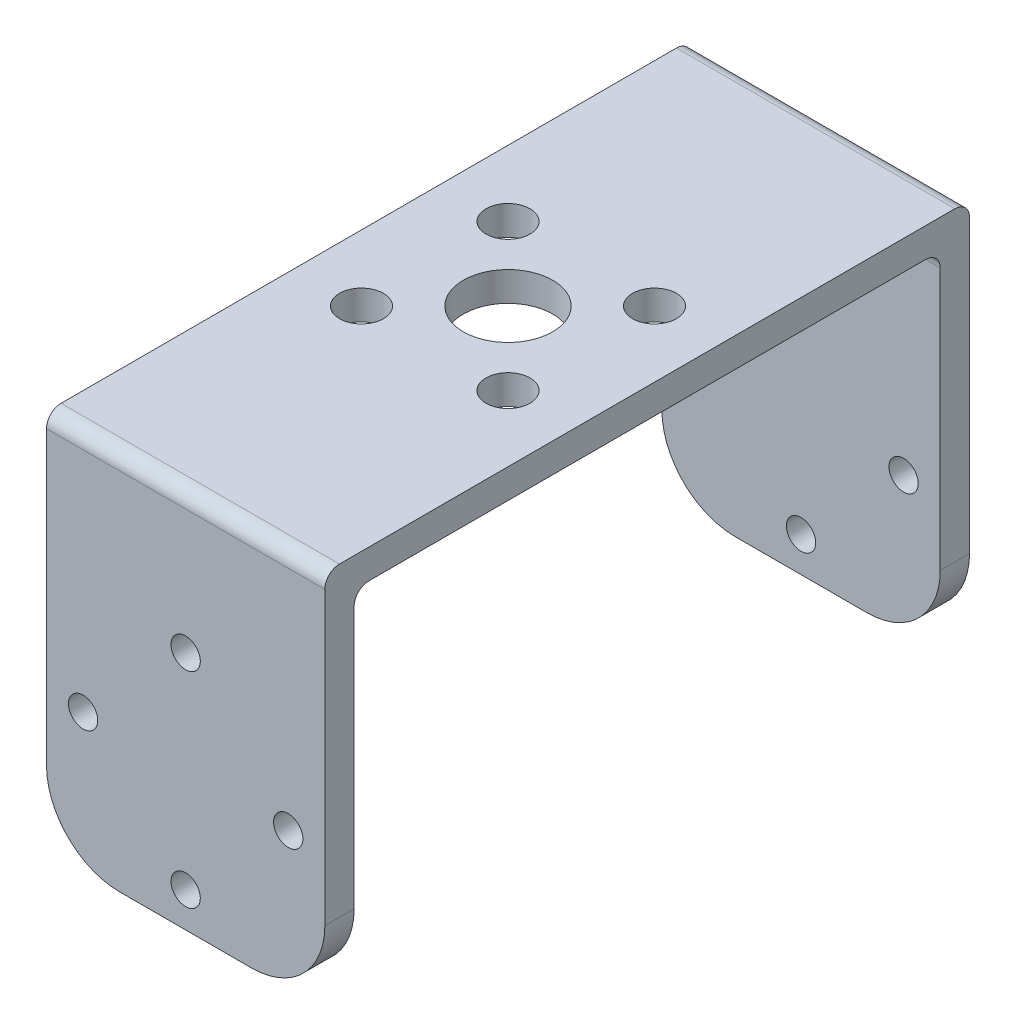
ISO-10303-21;
HEADER;
FILE_DESCRIPTION(('STEP AP214'),'2;1');
FILE_NAME('part.step','',(''),(''),'','','');
FILE_SCHEMA(('AUTOMOTIVE_DESIGN { 1 0 10303 214 1 1 1 1 }'));
ENDSEC;
DATA;
#1=APPLICATION_CONTEXT('core data for automotive mechanical design processes');
#2=APPLICATION_PROTOCOL_DEFINITION('international standard','automotive_design',2000,#1);
#3=PRODUCT_CONTEXT('',#1,'mechanical');
#4=PRODUCT('Part','Part','',(#3));
#5=PRODUCT_RELATED_PRODUCT_CATEGORY('part','',(#4));
#6=PRODUCT_DEFINITION_FORMATION('','',#4);
#7=PRODUCT_DEFINITION_CONTEXT('part definition',#1,'design');
#8=PRODUCT_DEFINITION('design','',#6,#7);
#9=PRODUCT_DEFINITION_SHAPE('','',#8);
#10=(LENGTH_UNIT() NAMED_UNIT(*) SI_UNIT(.MILLI.,.METRE.));
#11=(NAMED_UNIT(*) PLANE_ANGLE_UNIT() SI_UNIT($,.RADIAN.));
#12=(NAMED_UNIT(*) SI_UNIT($,.STERADIAN.) SOLID_ANGLE_UNIT());
#13=UNCERTAINTY_MEASURE_WITH_UNIT(LENGTH_MEASURE(1.E-05),#10,'distance_accuracy_value','');
#14=(GEOMETRIC_REPRESENTATION_CONTEXT(3) GLOBAL_UNCERTAINTY_ASSIGNED_CONTEXT((#13)) GLOBAL_UNIT_ASSIGNED_CONTEXT((#10,
#11,#12)) REPRESENTATION_CONTEXT('',''));
#15=CARTESIAN_POINT('',(0.,0.,0.));
#16=DIRECTION('',(0.,0.,1.));
#17=DIRECTION('',(1.,0.,0.));
#18=AXIS2_PLACEMENT_3D('',#15,#16,#17);
#19=CARTESIAN_POINT('',(19.,-12.94,-20.));
#20=DIRECTION('',(0.,1.,0.));
#21=DIRECTION('',(0.,0.,1.));
#22=AXIS2_PLACEMENT_3D('',#19,#20,#21);
#23=PLANE('',#22);
#24=DIRECTION('',(-1.,0.,0.));
#25=VECTOR('',#24,1.);
#26=CARTESIAN_POINT('',(19.,-12.94,-20.));
#27=LINE('',#26,#25);
#28=CARTESIAN_POINT('',(14.,-12.94,-20.));
#29=VERTEX_POINT('',#28);
#30=CARTESIAN_POINT('',(5.,-12.94,-20.));
#31=VERTEX_POINT('',#30);
#32=EDGE_CURVE('E188',#29,#31,#27,.T.);
#33=ORIENTED_EDGE('',*,*,#32,.T.);
#34=DIRECTION('',(0.,0.,-1.));
#35=VECTOR('',#34,1.);
#36=CARTESIAN_POINT('',(5.,-12.94,-22.));
#37=LINE('',#36,#35);
#38=CARTESIAN_POINT('',(5.,-12.94,-22.));
#39=VERTEX_POINT('',#38);
#40=EDGE_CURVE('E269',#31,#39,#37,.T.);
#41=ORIENTED_EDGE('',*,*,#40,.T.);
#42=DIRECTION('',(-1.,0.,0.));
#43=VECTOR('',#42,1.);
#44=CARTESIAN_POINT('',(19.,-12.94,-22.));
#45=LINE('',#44,#43);
#46=CARTESIAN_POINT('',(14.,-12.94,-22.));
#47=VERTEX_POINT('',#46);
#48=EDGE_CURVE('E198',#47,#39,#45,.T.);
#49=ORIENTED_EDGE('',*,*,#48,.F.);
#50=DIRECTION('',(0.,0.,-1.));
#51=VECTOR('',#50,1.);
#52=CARTESIAN_POINT('',(14.,-12.94,-20.));
#53=LINE('',#52,#51);
#54=EDGE_CURVE('E267',#47,#29,#53,.F.);
#55=ORIENTED_EDGE('',*,*,#54,.T.);
#56=EDGE_LOOP('',(#33,#41,#49,#55));
#57=FACE_BOUND('',#56,.T.);
#58=ADVANCED_FACE('F35',(#57),#23,.F.);
#59=CARTESIAN_POINT('',(19.,12.94,-22.));
#60=DIRECTION('',(0.,0.,1.));
#61=DIRECTION('',(1.,0.,0.));
#62=AXIS2_PLACEMENT_3D('',#59,#60,#61);
#63=PLANE('',#62);
#64=CARTESIAN_POINT('',(2.5,-3.56,-21.9999999999914));
#65=DIRECTION('',(0.,0.,1.));
#66=DIRECTION('',(1.,0.,0.));
#67=AXIS2_PLACEMENT_3D('',#64,#65,#66);
#68=CIRCLE('',#67,1.);
#69=CARTESIAN_POINT('',(3.5,-3.56,-21.9999999999914));
#70=VERTEX_POINT('',#69);
#71=EDGE_CURVE('E320',#70,#70,#68,.T.);
#72=ORIENTED_EDGE('',*,*,#71,.T.);
#73=EDGE_LOOP('',(#72));
#74=FACE_BOUND('',#73,.T.);
#75=CARTESIAN_POINT('',(16.5,-3.56,-21.9999999999914));
#76=DIRECTION('',(0.,0.,1.));
#77=DIRECTION('',(1.,0.,0.));
#78=AXIS2_PLACEMENT_3D('',#75,#76,#77);
#79=CIRCLE('',#78,1.);
#80=CARTESIAN_POINT('',(17.5,-3.56,-21.9999999999914));
#81=VERTEX_POINT('',#80);
#82=EDGE_CURVE('E249',#81,#81,#79,.T.);
#83=ORIENTED_EDGE('',*,*,#82,.T.);
#84=EDGE_LOOP('',(#83));
#85=FACE_BOUND('',#84,.T.);
#86=CARTESIAN_POINT('',(9.5,-10.56,-21.9999999999914));
#87=DIRECTION('',(0.,0.,1.));
#88=DIRECTION('',(1.,0.,0.));
#89=AXIS2_PLACEMENT_3D('',#86,#87,#88);
#90=CIRCLE('',#89,0.999999999999999);
#91=CARTESIAN_POINT('',(10.5,-10.56,-21.9999999999914));
#92=VERTEX_POINT('',#91);
#93=EDGE_CURVE('E244',#92,#92,#90,.T.);
#94=ORIENTED_EDGE('',*,*,#93,.T.);
#95=EDGE_LOOP('',(#94));
#96=FACE_BOUND('',#95,.T.);
#97=CARTESIAN_POINT('',(9.5,3.44,-21.9999999999914));
#98=DIRECTION('',(0.,0.,1.));
#99=DIRECTION('',(1.,0.,0.));
#100=AXIS2_PLACEMENT_3D('',#97,#98,#99);
#101=CIRCLE('',#100,1.);
#102=CARTESIAN_POINT('',(10.5,3.44,-21.9999999999914));
#103=VERTEX_POINT('',#102);
#104=EDGE_CURVE('E239',#103,#103,#101,.T.);
#105=ORIENTED_EDGE('',*,*,#104,.T.);
#106=EDGE_LOOP('',(#105));
#107=FACE_BOUND('',#106,.T.);
#108=ORIENTED_EDGE('',*,*,#48,.T.);
#109=CARTESIAN_POINT('',(5.,-7.94,-22.));
#110=DIRECTION('',(0.,0.,1.));
#111=DIRECTION('',(1.,0.,0.));
#112=AXIS2_PLACEMENT_3D('',#109,#110,#111);
#113=CIRCLE('',#112,5.);
#114=CARTESIAN_POINT('',(0.,-7.94,-22.));
#115=VERTEX_POINT('',#114);
#116=EDGE_CURVE('E274',#39,#115,#113,.F.);
#117=ORIENTED_EDGE('',*,*,#116,.T.);
#118=DIRECTION('',(0.,1.,0.));
#119=VECTOR('',#118,1.);
#120=CARTESIAN_POINT('',(0.,12.94,-22.));
#121=LINE('',#120,#119);
#122=CARTESIAN_POINT('',(0.,11.94,-22.));
#123=VERTEX_POINT('',#122);
#124=EDGE_CURVE('E323',#115,#123,#121,.T.);
#125=ORIENTED_EDGE('',*,*,#124,.T.);
#126=DIRECTION('',(-1.,0.,0.));
#127=VECTOR('',#126,1.);
#128=CARTESIAN_POINT('',(19.,11.94,-22.));
#129=LINE('',#128,#127);
#130=CARTESIAN_POINT('',(19.,11.94,-22.));
#131=VERTEX_POINT('',#130);
#132=EDGE_CURVE('E165',#123,#131,#129,.F.);
#133=ORIENTED_EDGE('',*,*,#132,.T.);
#134=DIRECTION('',(0.,1.,0.));
#135=VECTOR('',#134,1.);
#136=CARTESIAN_POINT('',(19.,12.94,-22.));
#137=LINE('',#136,#135);
#138=CARTESIAN_POINT('',(19.,-7.94,-22.));
#139=VERTEX_POINT('',#138);
#140=EDGE_CURVE('E182',#139,#131,#137,.T.);
#141=ORIENTED_EDGE('',*,*,#140,.F.);
#142=CARTESIAN_POINT('',(14.,-7.94,-22.));
#143=DIRECTION('',(0.,0.,1.));
#144=DIRECTION('',(1.,0.,0.));
#145=AXIS2_PLACEMENT_3D('',#142,#143,#144);
#146=CIRCLE('',#145,5.);
#147=EDGE_CURVE('E272',#139,#47,#146,.F.);
#148=ORIENTED_EDGE('',*,*,#147,.T.);
#149=EDGE_LOOP('',(#108,#117,#125,#133,#141,#148));
#150=FACE_BOUND('',#149,.T.);
#151=ADVANCED_FACE('F388',(#74,#85,#96,#107,#150),#63,.F.);
#152=CARTESIAN_POINT('',(19.,12.94,22.));
#153=DIRECTION('',(0.,-1.,0.));
#154=DIRECTION('',(0.,0.,-1.));
#155=AXIS2_PLACEMENT_3D('',#152,#153,#154);
#156=PLANE('',#155);
#157=CARTESIAN_POINT('',(4.5,12.94,5.));
#158=DIRECTION('',(0.,1.,0.));
#159=DIRECTION('',(0.,0.,1.));
#160=AXIS2_PLACEMENT_3D('',#157,#158,#159);
#161=CIRCLE('',#160,1.5);
#162=CARTESIAN_POINT('',(4.5,12.94,6.5));
#163=VERTEX_POINT('',#162);
#164=EDGE_CURVE('E615',#163,#163,#161,.T.);
#165=ORIENTED_EDGE('',*,*,#164,.F.);
#166=EDGE_LOOP('',(#165));
#167=FACE_BOUND('',#166,.T.);
#168=CARTESIAN_POINT('',(14.5,12.94,5.));
#169=DIRECTION('',(0.,1.,0.));
#170=DIRECTION('',(0.,0.,1.));
#171=AXIS2_PLACEMENT_3D('',#168,#169,#170);
#172=CIRCLE('',#171,1.5);
#173=CARTESIAN_POINT('',(14.5,12.94,6.5));
#174=VERTEX_POINT('',#173);
#175=EDGE_CURVE('E616',#174,#174,#172,.T.);
#176=ORIENTED_EDGE('',*,*,#175,.F.);
#177=EDGE_LOOP('',(#176));
#178=FACE_BOUND('',#177,.T.);
#179=CARTESIAN_POINT('',(14.5,12.94,-5.));
#180=DIRECTION('',(0.,1.,0.));
#181=DIRECTION('',(0.,0.,1.));
#182=AXIS2_PLACEMENT_3D('',#179,#180,#181);
#183=CIRCLE('',#182,1.5);
#184=CARTESIAN_POINT('',(14.5,12.94,-3.5));
#185=VERTEX_POINT('',#184);
#186=EDGE_CURVE('E619',#185,#185,#183,.T.);
#187=ORIENTED_EDGE('',*,*,#186,.F.);
#188=EDGE_LOOP('',(#187));
#189=FACE_BOUND('',#188,.T.);
#190=CARTESIAN_POINT('',(4.5,12.94,-5.));
#191=DIRECTION('',(0.,1.,0.));
#192=DIRECTION('',(0.,0.,1.));
#193=AXIS2_PLACEMENT_3D('',#190,#191,#192);
#194=CIRCLE('',#193,1.5);
#195=CARTESIAN_POINT('',(4.5,12.94,-3.5));
#196=VERTEX_POINT('',#195);
#197=EDGE_CURVE('E624',#196,#196,#194,.T.);
#198=ORIENTED_EDGE('',*,*,#197,.F.);
#199=EDGE_LOOP('',(#198));
#200=FACE_BOUND('',#199,.T.);
#201=CARTESIAN_POINT('',(9.5,12.94,0.));
#202=DIRECTION('',(0.,1.,0.));
#203=DIRECTION('',(0.,0.,1.));
#204=AXIS2_PLACEMENT_3D('',#201,#202,#203);
#205=CIRCLE('',#204,3.05);
#206=CARTESIAN_POINT('',(9.5,12.94,3.05));
#207=VERTEX_POINT('',#206);
#208=EDGE_CURVE('E283',#207,#207,#205,.T.);
#209=ORIENTED_EDGE('',*,*,#208,.F.);
#210=EDGE_LOOP('',(#209));
#211=FACE_BOUND('',#210,.T.);
#212=DIRECTION('',(0.,0.,1.));
#213=VECTOR('',#212,1.);
#214=CARTESIAN_POINT('',(0.,12.94,22.));
#215=LINE('',#214,#213);
#216=CARTESIAN_POINT('',(0.,12.94,-21.));
#217=VERTEX_POINT('',#216);
#218=CARTESIAN_POINT('',(0.,12.94,21.));
#219=VERTEX_POINT('',#218);
#220=EDGE_CURVE('E336',#217,#219,#215,.T.);
#221=ORIENTED_EDGE('',*,*,#220,.T.);
#222=DIRECTION('',(-1.,0.,0.));
#223=VECTOR('',#222,1.);
#224=CARTESIAN_POINT('',(19.,12.94,21.));
#225=LINE('',#224,#223);
#226=CARTESIAN_POINT('',(19.,12.94,21.));
#227=VERTEX_POINT('',#226);
#228=EDGE_CURVE('E214',#219,#227,#225,.F.);
#229=ORIENTED_EDGE('',*,*,#228,.T.);
#230=DIRECTION('',(0.,0.,1.));
#231=VECTOR('',#230,1.);
#232=CARTESIAN_POINT('',(19.,12.94,22.));
#233=LINE('',#232,#231);
#234=CARTESIAN_POINT('',(19.,12.94,-21.));
#235=VERTEX_POINT('',#234);
#236=EDGE_CURVE('E325',#235,#227,#233,.T.);
#237=ORIENTED_EDGE('',*,*,#236,.F.);
#238=DIRECTION('',(-1.,0.,0.));
#239=VECTOR('',#238,1.);
#240=CARTESIAN_POINT('',(19.,12.94,-21.));
#241=LINE('',#240,#239);
#242=EDGE_CURVE('E211',#235,#217,#241,.T.);
#243=ORIENTED_EDGE('',*,*,#242,.T.);
#244=EDGE_LOOP('',(#221,#229,#237,#243));
#245=FACE_BOUND('',#244,.T.);
#246=ADVANCED_FACE('F369',(#167,#178,#189,#200,#211,#245),#156,.F.);
#247=CARTESIAN_POINT('',(19.,12.94,22.));
#248=DIRECTION('',(0.,0.,-1.));
#249=DIRECTION('',(-1.,0.,0.));
#250=AXIS2_PLACEMENT_3D('',#247,#248,#249);
#251=PLANE('',#250);
#252=CARTESIAN_POINT('',(2.5,-3.56,22.));
#253=DIRECTION('',(0.,0.,1.));
#254=DIRECTION('',(1.,0.,0.));
#255=AXIS2_PLACEMENT_3D('',#252,#253,#254);
#256=CIRCLE('',#255,1.);
#257=CARTESIAN_POINT('',(3.5,-3.56,22.));
#258=VERTEX_POINT('',#257);
#259=EDGE_CURVE('E234',#258,#258,#256,.T.);
#260=ORIENTED_EDGE('',*,*,#259,.F.);
#261=EDGE_LOOP('',(#260));
#262=FACE_BOUND('',#261,.T.);
#263=CARTESIAN_POINT('',(16.5,-3.56,22.));
#264=DIRECTION('',(0.,0.,1.));
#265=DIRECTION('',(1.,0.,0.));
#266=AXIS2_PLACEMENT_3D('',#263,#264,#265);
#267=CIRCLE('',#266,1.);
#268=CARTESIAN_POINT('',(17.5,-3.56,22.));
#269=VERTEX_POINT('',#268);
#270=EDGE_CURVE('E302',#269,#269,#267,.T.);
#271=ORIENTED_EDGE('',*,*,#270,.F.);
#272=EDGE_LOOP('',(#271));
#273=FACE_BOUND('',#272,.T.);
#274=CARTESIAN_POINT('',(9.5,-10.56,22.));
#275=DIRECTION('',(0.,0.,1.));
#276=DIRECTION('',(1.,0.,0.));
#277=AXIS2_PLACEMENT_3D('',#274,#275,#276);
#278=CIRCLE('',#277,0.999999999999999);
#279=CARTESIAN_POINT('',(10.5,-10.56,22.));
#280=VERTEX_POINT('',#279);
#281=EDGE_CURVE('E297',#280,#280,#278,.T.);
#282=ORIENTED_EDGE('',*,*,#281,.F.);
#283=EDGE_LOOP('',(#282));
#284=FACE_BOUND('',#283,.T.);
#285=CARTESIAN_POINT('',(9.5,3.44,22.));
#286=DIRECTION('',(0.,0.,1.));
#287=DIRECTION('',(1.,0.,0.));
#288=AXIS2_PLACEMENT_3D('',#285,#286,#287);
#289=CIRCLE('',#288,1.);
#290=CARTESIAN_POINT('',(10.5,3.44,22.));
#291=VERTEX_POINT('',#290);
#292=EDGE_CURVE('E293',#291,#291,#289,.T.);
#293=ORIENTED_EDGE('',*,*,#292,.F.);
#294=EDGE_LOOP('',(#293));
#295=FACE_BOUND('',#294,.T.);
#296=DIRECTION('',(-1.,0.,0.));
#297=VECTOR('',#296,1.);
#298=CARTESIAN_POINT('',(19.,-12.94,22.));
#299=LINE('',#298,#297);
#300=CARTESIAN_POINT('',(14.,-12.94,22.));
#301=VERTEX_POINT('',#300);
#302=CARTESIAN_POINT('',(5.,-12.94,22.));
#303=VERTEX_POINT('',#302);
#304=EDGE_CURVE('E195',#301,#303,#299,.T.);
#305=ORIENTED_EDGE('',*,*,#304,.F.);
#306=CARTESIAN_POINT('',(14.,-7.94,22.));
#307=DIRECTION('',(0.,0.,-1.));
#308=DIRECTION('',(-1.,0.,0.));
#309=AXIS2_PLACEMENT_3D('',#306,#307,#308);
#310=CIRCLE('',#309,5.);
#311=CARTESIAN_POINT('',(19.,-7.94,22.));
#312=VERTEX_POINT('',#311);
#313=EDGE_CURVE('E263',#301,#312,#310,.F.);
#314=ORIENTED_EDGE('',*,*,#313,.T.);
#315=DIRECTION('',(0.,-1.,0.));
#316=VECTOR('',#315,1.);
#317=CARTESIAN_POINT('',(19.,12.94,22.));
#318=LINE('',#317,#316);
#319=CARTESIAN_POINT('',(19.,11.94,22.));
#320=VERTEX_POINT('',#319);
#321=EDGE_CURVE('E328',#320,#312,#318,.T.);
#322=ORIENTED_EDGE('',*,*,#321,.F.);
#323=DIRECTION('',(-1.,0.,0.));
#324=VECTOR('',#323,1.);
#325=CARTESIAN_POINT('',(19.,11.94,22.));
#326=LINE('',#325,#324);
#327=CARTESIAN_POINT('',(0.,11.94,22.));
#328=VERTEX_POINT('',#327);
#329=EDGE_CURVE('E203',#320,#328,#326,.T.);
#330=ORIENTED_EDGE('',*,*,#329,.T.);
#331=DIRECTION('',(0.,-1.,0.));
#332=VECTOR('',#331,1.);
#333=CARTESIAN_POINT('',(0.,12.94,22.));
#334=LINE('',#333,#332);
#335=CARTESIAN_POINT('',(0.,-7.94,22.));
#336=VERTEX_POINT('',#335);
#337=EDGE_CURVE('E184',#328,#336,#334,.T.);
#338=ORIENTED_EDGE('',*,*,#337,.T.);
#339=CARTESIAN_POINT('',(5.,-7.94,22.));
#340=DIRECTION('',(0.,0.,-1.));
#341=DIRECTION('',(-1.,0.,0.));
#342=AXIS2_PLACEMENT_3D('',#339,#340,#341);
#343=CIRCLE('',#342,5.);
#344=EDGE_CURVE('E261',#336,#303,#343,.F.);
#345=ORIENTED_EDGE('',*,*,#344,.T.);
#346=EDGE_LOOP('',(#305,#314,#322,#330,#338,#345));
#347=FACE_BOUND('',#346,.T.);
#348=ADVANCED_FACE('F343',(#262,#273,#284,#295,#347),#251,.F.);
#349=CARTESIAN_POINT('',(19.,-12.94,22.));
#350=DIRECTION('',(0.,1.,0.));
#351=DIRECTION('',(0.,0.,1.));
#352=AXIS2_PLACEMENT_3D('',#349,#350,#351);
#353=PLANE('',#352);
#354=DIRECTION('',(-1.,0.,0.));
#355=VECTOR('',#354,1.);
#356=CARTESIAN_POINT('',(19.,-12.94,20.));
#357=LINE('',#356,#355);
#358=CARTESIAN_POINT('',(14.,-12.94,20.));
#359=VERTEX_POINT('',#358);
#360=CARTESIAN_POINT('',(5.,-12.94,20.));
#361=VERTEX_POINT('',#360);
#362=EDGE_CURVE('E191',#359,#361,#357,.T.);
#363=ORIENTED_EDGE('',*,*,#362,.F.);
#364=DIRECTION('',(0.,0.,-1.));
#365=VECTOR('',#364,1.);
#366=CARTESIAN_POINT('',(14.,-12.94,22.));
#367=LINE('',#366,#365);
#368=EDGE_CURVE('E259',#359,#301,#367,.F.);
#369=ORIENTED_EDGE('',*,*,#368,.T.);
#370=ORIENTED_EDGE('',*,*,#304,.T.);
#371=DIRECTION('',(0.,0.,-1.));
#372=VECTOR('',#371,1.);
#373=CARTESIAN_POINT('',(5.,-12.94,20.));
#374=LINE('',#373,#372);
#375=EDGE_CURVE('E256',#303,#361,#374,.T.);
#376=ORIENTED_EDGE('',*,*,#375,.T.);
#377=EDGE_LOOP('',(#363,#369,#370,#376));
#378=FACE_BOUND('',#377,.T.);
#379=ADVANCED_FACE('F352',(#378),#353,.F.);
#380=CARTESIAN_POINT('',(19.,-12.94,20.));
#381=DIRECTION('',(0.,0.,1.));
#382=DIRECTION('',(1.,0.,0.));
#383=AXIS2_PLACEMENT_3D('',#380,#381,#382);
#384=PLANE('',#383);
#385=CARTESIAN_POINT('',(2.5,-3.56,19.9999999999818));
#386=DIRECTION('',(0.,0.,1.));
#387=DIRECTION('',(1.,0.,0.));
#388=AXIS2_PLACEMENT_3D('',#385,#386,#387);
#389=CIRCLE('',#388,1.);
#390=CARTESIAN_POINT('',(3.5,-3.56,19.9999999999818));
#391=VERTEX_POINT('',#390);
#392=EDGE_CURVE('E248',#391,#391,#389,.T.);
#393=ORIENTED_EDGE('',*,*,#392,.T.);
#394=EDGE_LOOP('',(#393));
#395=FACE_BOUND('',#394,.T.);
#396=CARTESIAN_POINT('',(16.5,-3.56,19.9999999999818));
#397=DIRECTION('',(0.,0.,1.));
#398=DIRECTION('',(1.,0.,0.));
#399=AXIS2_PLACEMENT_3D('',#396,#397,#398);
#400=CIRCLE('',#399,1.);
#401=CARTESIAN_POINT('',(17.5,-3.56,19.9999999999818));
#402=VERTEX_POINT('',#401);
#403=EDGE_CURVE('E243',#402,#402,#400,.T.);
#404=ORIENTED_EDGE('',*,*,#403,.T.);
#405=EDGE_LOOP('',(#404));
#406=FACE_BOUND('',#405,.T.);
#407=CARTESIAN_POINT('',(9.5,-10.56,19.9999999999818));
#408=DIRECTION('',(0.,0.,1.));
#409=DIRECTION('',(1.,0.,0.));
#410=AXIS2_PLACEMENT_3D('',#407,#408,#409);
#411=CIRCLE('',#410,0.999999999999999);
#412=CARTESIAN_POINT('',(10.5,-10.56,19.9999999999818));
#413=VERTEX_POINT('',#412);
#414=EDGE_CURVE('E238',#413,#413,#411,.T.);
#415=ORIENTED_EDGE('',*,*,#414,.T.);
#416=EDGE_LOOP('',(#415));
#417=FACE_BOUND('',#416,.T.);
#418=CARTESIAN_POINT('',(9.5,3.44,19.9999999999818));
#419=DIRECTION('',(0.,0.,1.));
#420=DIRECTION('',(1.,0.,0.));
#421=AXIS2_PLACEMENT_3D('',#418,#419,#420);
#422=CIRCLE('',#421,1.);
#423=CARTESIAN_POINT('',(10.5,3.44,19.9999999999818));
#424=VERTEX_POINT('',#423);
#425=EDGE_CURVE('E233',#424,#424,#422,.T.);
#426=ORIENTED_EDGE('',*,*,#425,.T.);
#427=EDGE_LOOP('',(#426));
#428=FACE_BOUND('',#427,.T.);
#429=DIRECTION('',(0.,1.,0.));
#430=VECTOR('',#429,1.);
#431=CARTESIAN_POINT('',(19.,-12.94,20.));
#432=LINE('',#431,#430);
#433=CARTESIAN_POINT('',(19.,-7.94,20.));
#434=VERTEX_POINT('',#433);
#435=CARTESIAN_POINT('',(19.,9.93999999999999,20.));
#436=VERTEX_POINT('',#435);
#437=EDGE_CURVE('E331',#434,#436,#432,.T.);
#438=ORIENTED_EDGE('',*,*,#437,.F.);
#439=CARTESIAN_POINT('',(14.,-7.94,20.));
#440=DIRECTION('',(0.,0.,1.));
#441=DIRECTION('',(1.,0.,0.));
#442=AXIS2_PLACEMENT_3D('',#439,#440,#441);
#443=CIRCLE('',#442,5.);
#444=EDGE_CURVE('E254',#434,#359,#443,.F.);
#445=ORIENTED_EDGE('',*,*,#444,.T.);
#446=ORIENTED_EDGE('',*,*,#362,.T.);
#447=CARTESIAN_POINT('',(5.,-7.94,20.));
#448=DIRECTION('',(0.,0.,1.));
#449=DIRECTION('',(1.,0.,0.));
#450=AXIS2_PLACEMENT_3D('',#447,#448,#449);
#451=CIRCLE('',#450,5.);
#452=CARTESIAN_POINT('',(0.,-7.94,20.));
#453=VERTEX_POINT('',#452);
#454=EDGE_CURVE('E252',#361,#453,#451,.F.);
#455=ORIENTED_EDGE('',*,*,#454,.T.);
#456=DIRECTION('',(0.,1.,0.));
#457=VECTOR('',#456,1.);
#458=CARTESIAN_POINT('',(0.,-12.94,20.));
#459=LINE('',#458,#457);
#460=CARTESIAN_POINT('',(0.,9.93999999999999,20.));
#461=VERTEX_POINT('',#460);
#462=EDGE_CURVE('E180',#453,#461,#459,.T.);
#463=ORIENTED_EDGE('',*,*,#462,.T.);
#464=DIRECTION('',(-1.,0.,0.));
#465=VECTOR('',#464,1.);
#466=CARTESIAN_POINT('',(19.,9.94,20.));
#467=LINE('',#466,#465);
#468=EDGE_CURVE('E161',#461,#436,#467,.F.);
#469=ORIENTED_EDGE('',*,*,#468,.T.);
#470=EDGE_LOOP('',(#438,#445,#446,#455,#463,#469));
#471=FACE_BOUND('',#470,.T.);
#472=ADVANCED_FACE('F356',(#395,#406,#417,#428,#471),#384,.F.);
#473=CARTESIAN_POINT('',(19.,10.94,20.));
#474=DIRECTION('',(0.,1.,0.));
#475=DIRECTION('',(0.,0.,1.));
#476=AXIS2_PLACEMENT_3D('',#473,#474,#475);
#477=PLANE('',#476);
#478=CARTESIAN_POINT('',(4.5,10.94,5.));
#479=DIRECTION('',(0.,1.,0.));
#480=DIRECTION('',(0.,0.,1.));
#481=AXIS2_PLACEMENT_3D('',#478,#479,#480);
#482=CIRCLE('',#481,1.5);
#483=CARTESIAN_POINT('',(4.5,10.94,6.5));
#484=VERTEX_POINT('',#483);
#485=EDGE_CURVE('E39',#484,#484,#482,.T.);
#486=ORIENTED_EDGE('',*,*,#485,.T.);
#487=EDGE_LOOP('',(#486));
#488=FACE_BOUND('',#487,.T.);
#489=CARTESIAN_POINT('',(14.5,10.94,5.));
#490=DIRECTION('',(0.,1.,0.));
#491=DIRECTION('',(0.,0.,1.));
#492=AXIS2_PLACEMENT_3D('',#489,#490,#491);
#493=CIRCLE('',#492,1.5);
#494=CARTESIAN_POINT('',(14.5,10.94,6.5));
#495=VERTEX_POINT('',#494);
#496=EDGE_CURVE('E288',#495,#495,#493,.T.);
#497=ORIENTED_EDGE('',*,*,#496,.T.);
#498=EDGE_LOOP('',(#497));
#499=FACE_BOUND('',#498,.T.);
#500=CARTESIAN_POINT('',(14.5,10.94,-5.));
#501=DIRECTION('',(0.,1.,0.));
#502=DIRECTION('',(0.,0.,1.));
#503=AXIS2_PLACEMENT_3D('',#500,#501,#502);
#504=CIRCLE('',#503,1.5);
#505=CARTESIAN_POINT('',(14.5,10.94,-3.5));
#506=VERTEX_POINT('',#505);
#507=EDGE_CURVE('E286',#506,#506,#504,.T.);
#508=ORIENTED_EDGE('',*,*,#507,.T.);
#509=EDGE_LOOP('',(#508));
#510=FACE_BOUND('',#509,.T.);
#511=CARTESIAN_POINT('',(4.5,10.94,-5.));
#512=DIRECTION('',(0.,1.,0.));
#513=DIRECTION('',(0.,0.,1.));
#514=AXIS2_PLACEMENT_3D('',#511,#512,#513);
#515=CIRCLE('',#514,1.5);
#516=CARTESIAN_POINT('',(4.5,10.94,-3.5));
#517=VERTEX_POINT('',#516);
#518=EDGE_CURVE('E282',#517,#517,#515,.T.);
#519=ORIENTED_EDGE('',*,*,#518,.T.);
#520=EDGE_LOOP('',(#519));
#521=FACE_BOUND('',#520,.T.);
#522=CARTESIAN_POINT('',(9.5,10.94,0.));
#523=DIRECTION('',(0.,1.,0.));
#524=DIRECTION('',(0.,0.,1.));
#525=AXIS2_PLACEMENT_3D('',#522,#523,#524);
#526=CIRCLE('',#525,3.05);
#527=CARTESIAN_POINT('',(9.5,10.94,3.05));
#528=VERTEX_POINT('',#527);
#529=EDGE_CURVE('E279',#528,#528,#526,.T.);
#530=ORIENTED_EDGE('',*,*,#529,.T.);
#531=EDGE_LOOP('',(#530));
#532=FACE_BOUND('',#531,.T.);
#533=DIRECTION('',(0.,0.,-1.));
#534=VECTOR('',#533,1.);
#535=CARTESIAN_POINT('',(19.,10.94,20.));
#536=LINE('',#535,#534);
#537=CARTESIAN_POINT('',(19.,10.94,19.));
#538=VERTEX_POINT('',#537);
#539=CARTESIAN_POINT('',(19.,10.94,-19.));
#540=VERTEX_POINT('',#539);
#541=EDGE_CURVE('E174',#538,#540,#536,.T.);
#542=ORIENTED_EDGE('',*,*,#541,.F.);
#543=DIRECTION('',(-1.,0.,0.));
#544=VECTOR('',#543,1.);
#545=CARTESIAN_POINT('',(0.,10.94,19.));
#546=LINE('',#545,#544);
#547=CARTESIAN_POINT('',(0.,10.94,19.));
#548=VERTEX_POINT('',#547);
#549=EDGE_CURVE('E159',#538,#548,#546,.T.);
#550=ORIENTED_EDGE('',*,*,#549,.T.);
#551=DIRECTION('',(0.,0.,-1.));
#552=VECTOR('',#551,1.);
#553=CARTESIAN_POINT('',(0.,10.94,20.));
#554=LINE('',#553,#552);
#555=CARTESIAN_POINT('',(0.,10.94,-19.));
#556=VERTEX_POINT('',#555);
#557=EDGE_CURVE('E171',#548,#556,#554,.T.);
#558=ORIENTED_EDGE('',*,*,#557,.T.);
#559=DIRECTION('',(-1.,0.,0.));
#560=VECTOR('',#559,1.);
#561=CARTESIAN_POINT('',(19.,10.94,-19.));
#562=LINE('',#561,#560);
#563=EDGE_CURVE('E175',#556,#540,#562,.F.);
#564=ORIENTED_EDGE('',*,*,#563,.T.);
#565=EDGE_LOOP('',(#542,#550,#558,#564));
#566=FACE_BOUND('',#565,.T.);
#567=ADVANCED_FACE('F170',(#488,#499,#510,#521,#532,#566),#477,.F.);
#568=CARTESIAN_POINT('',(19.,10.94,-20.));
#569=DIRECTION('',(0.,0.,-1.));
#570=DIRECTION('',(0.,1.,0.));
#571=AXIS2_PLACEMENT_3D('',#568,#569,#570);
#572=PLANE('',#571);
#573=CARTESIAN_POINT('',(2.5,-3.56,-19.9999999999818));
#574=DIRECTION('',(0.,0.,-1.));
#575=DIRECTION('',(0.,1.,0.));
#576=AXIS2_PLACEMENT_3D('',#573,#574,#575);
#577=CIRCLE('',#576,1.);
#578=CARTESIAN_POINT('',(2.5,-2.56,-19.9999999999818));
#579=VERTEX_POINT('',#578);
#580=EDGE_CURVE('E245',#579,#579,#577,.T.);
#581=ORIENTED_EDGE('',*,*,#580,.T.);
#582=EDGE_LOOP('',(#581));
#583=FACE_BOUND('',#582,.T.);
#584=CARTESIAN_POINT('',(16.5,-3.56,-19.9999999999818));
#585=DIRECTION('',(0.,0.,-1.));
#586=DIRECTION('',(0.,1.,0.));
#587=AXIS2_PLACEMENT_3D('',#584,#585,#586);
#588=CIRCLE('',#587,1.);
#589=CARTESIAN_POINT('',(16.5,-2.56,-19.9999999999818));
#590=VERTEX_POINT('',#589);
#591=EDGE_CURVE('E240',#590,#590,#588,.T.);
#592=ORIENTED_EDGE('',*,*,#591,.T.);
#593=EDGE_LOOP('',(#592));
#594=FACE_BOUND('',#593,.T.);
#595=CARTESIAN_POINT('',(9.5,-10.56,-19.9999999999818));
#596=DIRECTION('',(0.,0.,-1.));
#597=DIRECTION('',(0.,1.,0.));
#598=AXIS2_PLACEMENT_3D('',#595,#596,#597);
#599=CIRCLE('',#598,0.999999999999999);
#600=CARTESIAN_POINT('',(9.5,-9.56,-19.9999999999818));
#601=VERTEX_POINT('',#600);
#602=EDGE_CURVE('E235',#601,#601,#599,.T.);
#603=ORIENTED_EDGE('',*,*,#602,.T.);
#604=EDGE_LOOP('',(#603));
#605=FACE_BOUND('',#604,.T.);
#606=CARTESIAN_POINT('',(9.5,3.44,-19.9999999999818));
#607=DIRECTION('',(0.,0.,-1.));
#608=DIRECTION('',(0.,1.,0.));
#609=AXIS2_PLACEMENT_3D('',#606,#607,#608);
#610=CIRCLE('',#609,1.);
#611=CARTESIAN_POINT('',(9.5,4.44,-19.9999999999818));
#612=VERTEX_POINT('',#611);
#613=EDGE_CURVE('E230',#612,#612,#610,.T.);
#614=ORIENTED_EDGE('',*,*,#613,.T.);
#615=EDGE_LOOP('',(#614));
#616=FACE_BOUND('',#615,.T.);
#617=DIRECTION('',(0.,-1.,0.));
#618=VECTOR('',#617,1.);
#619=CARTESIAN_POINT('',(0.,10.94,-20.));
#620=LINE('',#619,#618);
#621=CARTESIAN_POINT('',(0.,9.94,-20.));
#622=VERTEX_POINT('',#621);
#623=CARTESIAN_POINT('',(0.,-7.93999999999999,-20.));
#624=VERTEX_POINT('',#623);
#625=EDGE_CURVE('E179',#622,#624,#620,.T.);
#626=ORIENTED_EDGE('',*,*,#625,.T.);
#627=CARTESIAN_POINT('',(5.,-7.94,-20.));
#628=DIRECTION('',(0.,0.,-1.));
#629=DIRECTION('',(0.,1.,0.));
#630=AXIS2_PLACEMENT_3D('',#627,#628,#629);
#631=CIRCLE('',#630,5.);
#632=EDGE_CURVE('E44',#624,#31,#631,.F.);
#633=ORIENTED_EDGE('',*,*,#632,.T.);
#634=ORIENTED_EDGE('',*,*,#32,.F.);
#635=CARTESIAN_POINT('',(14.,-7.94,-20.));
#636=DIRECTION('',(0.,0.,-1.));
#637=DIRECTION('',(0.,1.,0.));
#638=AXIS2_PLACEMENT_3D('',#635,#636,#637);
#639=CIRCLE('',#638,5.);
#640=CARTESIAN_POINT('',(19.,-7.93999999999999,-20.));
#641=VERTEX_POINT('',#640);
#642=EDGE_CURVE('E52',#29,#641,#639,.F.);
#643=ORIENTED_EDGE('',*,*,#642,.T.);
#644=DIRECTION('',(0.,-1.,0.));
#645=VECTOR('',#644,1.);
#646=CARTESIAN_POINT('',(19.,10.94,-20.));
#647=LINE('',#646,#645);
#648=CARTESIAN_POINT('',(19.,9.94,-20.));
#649=VERTEX_POINT('',#648);
#650=EDGE_CURVE('E192',#649,#641,#647,.T.);
#651=ORIENTED_EDGE('',*,*,#650,.F.);
#652=DIRECTION('',(-1.,0.,0.));
#653=VECTOR('',#652,1.);
#654=CARTESIAN_POINT('',(0.,9.94,-20.));
#655=LINE('',#654,#653);
#656=EDGE_CURVE('E220',#649,#622,#655,.T.);
#657=ORIENTED_EDGE('',*,*,#656,.T.);
#658=EDGE_LOOP('',(#626,#633,#634,#643,#651,#657));
#659=FACE_BOUND('',#658,.T.);
#660=ADVANCED_FACE('F381',(#583,#594,#605,#616,#659),#572,.F.);
#661=CARTESIAN_POINT('',(19.,0.,0.));
#662=DIRECTION('',(-1.,0.,0.));
#663=DIRECTION('',(0.,0.,1.));
#664=AXIS2_PLACEMENT_3D('',#661,#662,#663);
#665=PLANE('',#664);
#666=ORIENTED_EDGE('',*,*,#650,.T.);
#667=DIRECTION('',(0.,0.,-1.));
#668=VECTOR('',#667,1.);
#669=CARTESIAN_POINT('',(19.,-7.94,0.));
#670=LINE('',#669,#668);
#671=EDGE_CURVE('E11',#641,#139,#670,.T.);
#672=ORIENTED_EDGE('',*,*,#671,.T.);
#673=ORIENTED_EDGE('',*,*,#140,.T.);
#674=CARTESIAN_POINT('',(19.,11.94,-21.));
#675=DIRECTION('',(-1.,0.,0.));
#676=DIRECTION('',(0.,0.,1.));
#677=AXIS2_PLACEMENT_3D('',#674,#675,#676);
#678=CIRCLE('',#677,1.);
#679=EDGE_CURVE('E216',#131,#235,#678,.F.);
#680=ORIENTED_EDGE('',*,*,#679,.T.);
#681=ORIENTED_EDGE('',*,*,#236,.T.);
#682=CARTESIAN_POINT('',(19.,11.94,21.));
#683=DIRECTION('',(-1.,0.,0.));
#684=DIRECTION('',(0.,0.,1.));
#685=AXIS2_PLACEMENT_3D('',#682,#683,#684);
#686=CIRCLE('',#685,1.);
#687=EDGE_CURVE('E218',#227,#320,#686,.F.);
#688=ORIENTED_EDGE('',*,*,#687,.T.);
#689=ORIENTED_EDGE('',*,*,#321,.T.);
#690=DIRECTION('',(0.,0.,-1.));
#691=VECTOR('',#690,1.);
#692=CARTESIAN_POINT('',(19.,-7.94,0.));
#693=LINE('',#692,#691);
#694=EDGE_CURVE('E229',#312,#434,#693,.T.);
#695=ORIENTED_EDGE('',*,*,#694,.T.);
#696=ORIENTED_EDGE('',*,*,#437,.T.);
#697=CARTESIAN_POINT('',(19.,9.94,19.));
#698=DIRECTION('',(-1.,0.,0.));
#699=DIRECTION('',(0.,0.,1.));
#700=AXIS2_PLACEMENT_3D('',#697,#698,#699);
#701=CIRCLE('',#700,1.);
#702=EDGE_CURVE('E164',#436,#538,#701,.T.);
#703=ORIENTED_EDGE('',*,*,#702,.T.);
#704=ORIENTED_EDGE('',*,*,#541,.T.);
#705=CARTESIAN_POINT('',(19.,9.94,-19.));
#706=DIRECTION('',(-1.,0.,0.));
#707=DIRECTION('',(0.,0.,1.));
#708=AXIS2_PLACEMENT_3D('',#705,#706,#707);
#709=CIRCLE('',#708,1.);
#710=EDGE_CURVE('E227',#540,#649,#709,.T.);
#711=ORIENTED_EDGE('',*,*,#710,.T.);
#712=EDGE_LOOP('',(#666,#672,#673,#680,#681,#688,#689,#695,#696,#703,#704,#711));
#713=FACE_BOUND('',#712,.T.);
#714=ADVANCED_FACE('F362',(#713),#665,.F.);
#715=CARTESIAN_POINT('',(0.,0.,0.));
#716=DIRECTION('',(-1.,0.,0.));
#717=DIRECTION('',(0.,0.,1.));
#718=AXIS2_PLACEMENT_3D('',#715,#716,#717);
#719=PLANE('',#718);
#720=ORIENTED_EDGE('',*,*,#124,.F.);
#721=DIRECTION('',(0.,0.,-1.));
#722=VECTOR('',#721,1.);
#723=CARTESIAN_POINT('',(0.,-7.94,-20.));
#724=LINE('',#723,#722);
#725=EDGE_CURVE('E60',#115,#624,#724,.F.);
#726=ORIENTED_EDGE('',*,*,#725,.T.);
#727=ORIENTED_EDGE('',*,*,#625,.F.);
#728=CARTESIAN_POINT('',(0.,9.94,-19.));
#729=DIRECTION('',(-1.,0.,0.));
#730=DIRECTION('',(0.,0.,1.));
#731=AXIS2_PLACEMENT_3D('',#728,#729,#730);
#732=CIRCLE('',#731,1.);
#733=EDGE_CURVE('E178',#622,#556,#732,.F.);
#734=ORIENTED_EDGE('',*,*,#733,.T.);
#735=ORIENTED_EDGE('',*,*,#557,.F.);
#736=CARTESIAN_POINT('',(0.,9.94,19.));
#737=DIRECTION('',(-1.,0.,0.));
#738=DIRECTION('',(0.,0.,1.));
#739=AXIS2_PLACEMENT_3D('',#736,#737,#738);
#740=CIRCLE('',#739,1.);
#741=EDGE_CURVE('E155',#548,#461,#740,.F.);
#742=ORIENTED_EDGE('',*,*,#741,.T.);
#743=ORIENTED_EDGE('',*,*,#462,.F.);
#744=DIRECTION('',(0.,0.,-1.));
#745=VECTOR('',#744,1.);
#746=CARTESIAN_POINT('',(0.,-7.94,22.));
#747=LINE('',#746,#745);
#748=EDGE_CURVE('E265',#453,#336,#747,.F.);
#749=ORIENTED_EDGE('',*,*,#748,.T.);
#750=ORIENTED_EDGE('',*,*,#337,.F.);
#751=CARTESIAN_POINT('',(0.,11.94,21.));
#752=DIRECTION('',(-1.,0.,0.));
#753=DIRECTION('',(0.,0.,1.));
#754=AXIS2_PLACEMENT_3D('',#751,#752,#753);
#755=CIRCLE('',#754,1.);
#756=EDGE_CURVE('E209',#328,#219,#755,.T.);
#757=ORIENTED_EDGE('',*,*,#756,.T.);
#758=ORIENTED_EDGE('',*,*,#220,.F.);
#759=CARTESIAN_POINT('',(0.,11.94,-21.));
#760=DIRECTION('',(-1.,0.,0.));
#761=DIRECTION('',(0.,0.,1.));
#762=AXIS2_PLACEMENT_3D('',#759,#760,#761);
#763=CIRCLE('',#762,1.);
#764=EDGE_CURVE('E206',#217,#123,#763,.T.);
#765=ORIENTED_EDGE('',*,*,#764,.T.);
#766=EDGE_LOOP('',(#720,#726,#727,#734,#735,#742,#743,#749,#750,#757,#758,#765));
#767=FACE_BOUND('',#766,.T.);
#768=ADVANCED_FACE('F177',(#767),#719,.T.);
#769=CARTESIAN_POINT('',(19.,9.94,19.));
#770=DIRECTION('',(1.,0.,0.));
#771=DIRECTION('',(0.,0.,-1.));
#772=AXIS2_PLACEMENT_3D('',#769,#770,#771);
#773=CYLINDRICAL_SURFACE('',#772,1.);
#774=ORIENTED_EDGE('',*,*,#702,.F.);
#775=ORIENTED_EDGE('',*,*,#468,.F.);
#776=ORIENTED_EDGE('',*,*,#741,.F.);
#777=ORIENTED_EDGE('',*,*,#549,.F.);
#778=EDGE_LOOP('',(#774,#775,#776,#777));
#779=FACE_BOUND('',#778,.T.);
#780=ADVANCED_FACE('F158',(#779),#773,.F.);
#781=CARTESIAN_POINT('',(19.,11.94,21.));
#782=DIRECTION('',(-1.,0.,0.));
#783=DIRECTION('',(0.,0.,1.));
#784=AXIS2_PLACEMENT_3D('',#781,#782,#783);
#785=CYLINDRICAL_SURFACE('',#784,1.);
#786=ORIENTED_EDGE('',*,*,#687,.F.);
#787=ORIENTED_EDGE('',*,*,#228,.F.);
#788=ORIENTED_EDGE('',*,*,#756,.F.);
#789=ORIENTED_EDGE('',*,*,#329,.F.);
#790=EDGE_LOOP('',(#786,#787,#788,#789));
#791=FACE_BOUND('',#790,.T.);
#792=ADVANCED_FACE('F365',(#791),#785,.T.);
#793=CARTESIAN_POINT('',(19.,9.94,-19.));
#794=DIRECTION('',(1.,0.,0.));
#795=DIRECTION('',(0.,0.,-1.));
#796=AXIS2_PLACEMENT_3D('',#793,#794,#795);
#797=CYLINDRICAL_SURFACE('',#796,1.);
#798=ORIENTED_EDGE('',*,*,#710,.F.);
#799=ORIENTED_EDGE('',*,*,#563,.F.);
#800=ORIENTED_EDGE('',*,*,#733,.F.);
#801=ORIENTED_EDGE('',*,*,#656,.F.);
#802=EDGE_LOOP('',(#798,#799,#800,#801));
#803=FACE_BOUND('',#802,.T.);
#804=ADVANCED_FACE('F406',(#803),#797,.F.);
#805=CARTESIAN_POINT('',(19.,11.94,-21.));
#806=DIRECTION('',(-1.,0.,0.));
#807=DIRECTION('',(0.,0.,1.));
#808=AXIS2_PLACEMENT_3D('',#805,#806,#807);
#809=CYLINDRICAL_SURFACE('',#808,1.);
#810=ORIENTED_EDGE('',*,*,#679,.F.);
#811=ORIENTED_EDGE('',*,*,#132,.F.);
#812=ORIENTED_EDGE('',*,*,#764,.F.);
#813=ORIENTED_EDGE('',*,*,#242,.F.);
#814=EDGE_LOOP('',(#810,#811,#812,#813));
#815=FACE_BOUND('',#814,.T.);
#816=ADVANCED_FACE('F374',(#815),#809,.T.);
#817=CARTESIAN_POINT('',(9.5,3.44,-499978.));
#818=DIRECTION('',(0.,0.,1.));
#819=DIRECTION('',(1.,0.,0.));
#820=AXIS2_PLACEMENT_3D('',#817,#818,#819);
#821=CYLINDRICAL_SURFACE('',#820,1.);
#822=ORIENTED_EDGE('',*,*,#613,.F.);
#823=EDGE_LOOP('',(#822));
#824=FACE_BOUND('',#823,.T.);
#825=ORIENTED_EDGE('',*,*,#104,.F.);
#826=EDGE_LOOP('',(#825));
#827=FACE_BOUND('',#826,.T.);
#828=ADVANCED_FACE('F412',(#824,#827),#821,.F.);
#829=CARTESIAN_POINT('',(9.5,-10.56,-499978.));
#830=DIRECTION('',(0.,0.,1.));
#831=DIRECTION('',(1.,0.,0.));
#832=AXIS2_PLACEMENT_3D('',#829,#830,#831);
#833=CYLINDRICAL_SURFACE('',#832,0.999999999999999);
#834=ORIENTED_EDGE('',*,*,#602,.F.);
#835=EDGE_LOOP('',(#834));
#836=FACE_BOUND('',#835,.T.);
#837=ORIENTED_EDGE('',*,*,#93,.F.);
#838=EDGE_LOOP('',(#837));
#839=FACE_BOUND('',#838,.T.);
#840=ADVANCED_FACE('F448',(#836,#839),#833,.F.);
#841=CARTESIAN_POINT('',(16.5,-3.56,-499978.));
#842=DIRECTION('',(0.,0.,1.));
#843=DIRECTION('',(1.,0.,0.));
#844=AXIS2_PLACEMENT_3D('',#841,#842,#843);
#845=CYLINDRICAL_SURFACE('',#844,1.);
#846=ORIENTED_EDGE('',*,*,#591,.F.);
#847=EDGE_LOOP('',(#846));
#848=FACE_BOUND('',#847,.T.);
#849=ORIENTED_EDGE('',*,*,#82,.F.);
#850=EDGE_LOOP('',(#849));
#851=FACE_BOUND('',#850,.T.);
#852=ADVANCED_FACE('F444',(#848,#851),#845,.F.);
#853=CARTESIAN_POINT('',(2.5,-3.56,-499978.));
#854=DIRECTION('',(0.,0.,1.));
#855=DIRECTION('',(1.,0.,0.));
#856=AXIS2_PLACEMENT_3D('',#853,#854,#855);
#857=CYLINDRICAL_SURFACE('',#856,1.);
#858=ORIENTED_EDGE('',*,*,#580,.F.);
#859=EDGE_LOOP('',(#858));
#860=FACE_BOUND('',#859,.T.);
#861=ORIENTED_EDGE('',*,*,#71,.F.);
#862=EDGE_LOOP('',(#861));
#863=FACE_BOUND('',#862,.T.);
#864=ADVANCED_FACE('F440',(#860,#863),#857,.F.);
#865=ORIENTED_EDGE('',*,*,#292,.T.);
#866=EDGE_LOOP('',(#865));
#867=FACE_BOUND('',#866,.T.);
#868=ORIENTED_EDGE('',*,*,#425,.F.);
#869=EDGE_LOOP('',(#868));
#870=FACE_BOUND('',#869,.T.);
#871=ADVANCED_FACE('F443',(#867,#870),#821,.F.);
#872=ORIENTED_EDGE('',*,*,#281,.T.);
#873=EDGE_LOOP('',(#872));
#874=FACE_BOUND('',#873,.T.);
#875=ORIENTED_EDGE('',*,*,#414,.F.);
#876=EDGE_LOOP('',(#875));
#877=FACE_BOUND('',#876,.T.);
#878=ADVANCED_FACE('F454',(#874,#877),#833,.F.);
#879=ORIENTED_EDGE('',*,*,#270,.T.);
#880=EDGE_LOOP('',(#879));
#881=FACE_BOUND('',#880,.T.);
#882=ORIENTED_EDGE('',*,*,#403,.F.);
#883=EDGE_LOOP('',(#882));
#884=FACE_BOUND('',#883,.T.);
#885=ADVANCED_FACE('F450',(#881,#884),#845,.F.);
#886=ORIENTED_EDGE('',*,*,#259,.T.);
#887=EDGE_LOOP('',(#886));
#888=FACE_BOUND('',#887,.T.);
#889=ORIENTED_EDGE('',*,*,#392,.F.);
#890=EDGE_LOOP('',(#889));
#891=FACE_BOUND('',#890,.T.);
#892=ADVANCED_FACE('F415',(#888,#891),#857,.F.);
#893=CARTESIAN_POINT('',(14.,-7.94,0.));
#894=DIRECTION('',(0.,0.,-1.));
#895=DIRECTION('',(-1.,0.,0.));
#896=AXIS2_PLACEMENT_3D('',#893,#894,#895);
#897=CYLINDRICAL_SURFACE('',#896,5.);
#898=ORIENTED_EDGE('',*,*,#313,.F.);
#899=ORIENTED_EDGE('',*,*,#368,.F.);
#900=ORIENTED_EDGE('',*,*,#444,.F.);
#901=ORIENTED_EDGE('',*,*,#694,.F.);
#902=EDGE_LOOP('',(#898,#899,#900,#901));
#903=FACE_BOUND('',#902,.T.);
#904=ADVANCED_FACE('F360',(#903),#897,.T.);
#905=CARTESIAN_POINT('',(5.,-7.94,22.));
#906=DIRECTION('',(0.,0.,1.));
#907=DIRECTION('',(1.,0.,0.));
#908=AXIS2_PLACEMENT_3D('',#905,#906,#907);
#909=CYLINDRICAL_SURFACE('',#908,5.);
#910=ORIENTED_EDGE('',*,*,#344,.F.);
#911=ORIENTED_EDGE('',*,*,#748,.F.);
#912=ORIENTED_EDGE('',*,*,#454,.F.);
#913=ORIENTED_EDGE('',*,*,#375,.F.);
#914=EDGE_LOOP('',(#910,#911,#912,#913));
#915=FACE_BOUND('',#914,.T.);
#916=ADVANCED_FACE('F349',(#915),#909,.T.);
#917=CARTESIAN_POINT('',(5.,-7.94,-20.));
#918=DIRECTION('',(0.,0.,1.));
#919=DIRECTION('',(1.,0.,0.));
#920=AXIS2_PLACEMENT_3D('',#917,#918,#919);
#921=CYLINDRICAL_SURFACE('',#920,5.);
#922=ORIENTED_EDGE('',*,*,#632,.F.);
#923=ORIENTED_EDGE('',*,*,#725,.F.);
#924=ORIENTED_EDGE('',*,*,#116,.F.);
#925=ORIENTED_EDGE('',*,*,#40,.F.);
#926=EDGE_LOOP('',(#922,#923,#924,#925));
#927=FACE_BOUND('',#926,.T.);
#928=ADVANCED_FACE('F379',(#927),#921,.T.);
#929=CARTESIAN_POINT('',(14.,-7.94,0.));
#930=DIRECTION('',(0.,0.,-1.));
#931=DIRECTION('',(-1.,0.,0.));
#932=AXIS2_PLACEMENT_3D('',#929,#930,#931);
#933=CYLINDRICAL_SURFACE('',#932,5.);
#934=ORIENTED_EDGE('',*,*,#642,.F.);
#935=ORIENTED_EDGE('',*,*,#54,.F.);
#936=ORIENTED_EDGE('',*,*,#147,.F.);
#937=ORIENTED_EDGE('',*,*,#671,.F.);
#938=EDGE_LOOP('',(#934,#935,#936,#937));
#939=FACE_BOUND('',#938,.T.);
#940=ADVANCED_FACE('F37',(#939),#933,.T.);
#941=CARTESIAN_POINT('',(9.5,-487.06,0.));
#942=DIRECTION('',(0.,1.,0.));
#943=DIRECTION('',(0.,0.,1.));
#944=AXIS2_PLACEMENT_3D('',#941,#942,#943);
#945=CYLINDRICAL_SURFACE('',#944,3.05);
#946=ORIENTED_EDGE('',*,*,#208,.T.);
#947=EDGE_LOOP('',(#946));
#948=FACE_BOUND('',#947,.T.);
#949=ORIENTED_EDGE('',*,*,#529,.F.);
#950=EDGE_LOOP('',(#949));
#951=FACE_BOUND('',#950,.T.);
#952=ADVANCED_FACE('F421',(#948,#951),#945,.F.);
#953=CARTESIAN_POINT('',(4.5,-487.06,-5.));
#954=DIRECTION('',(0.,1.,0.));
#955=DIRECTION('',(0.,0.,1.));
#956=AXIS2_PLACEMENT_3D('',#953,#954,#955);
#957=CYLINDRICAL_SURFACE('',#956,1.5);
#958=ORIENTED_EDGE('',*,*,#197,.T.);
#959=EDGE_LOOP('',(#958));
#960=FACE_BOUND('',#959,.T.);
#961=ORIENTED_EDGE('',*,*,#518,.F.);
#962=EDGE_LOOP('',(#961));
#963=FACE_BOUND('',#962,.T.);
#964=ADVANCED_FACE('F425',(#960,#963),#957,.F.);
#965=CARTESIAN_POINT('',(14.5,-487.06,-5.));
#966=DIRECTION('',(0.,1.,0.));
#967=DIRECTION('',(0.,0.,1.));
#968=AXIS2_PLACEMENT_3D('',#965,#966,#967);
#969=CYLINDRICAL_SURFACE('',#968,1.5);
#970=ORIENTED_EDGE('',*,*,#186,.T.);
#971=EDGE_LOOP('',(#970));
#972=FACE_BOUND('',#971,.T.);
#973=ORIENTED_EDGE('',*,*,#507,.F.);
#974=EDGE_LOOP('',(#973));
#975=FACE_BOUND('',#974,.T.);
#976=ADVANCED_FACE('F431',(#972,#975),#969,.F.);
#977=CARTESIAN_POINT('',(14.5,-487.06,5.));
#978=DIRECTION('',(0.,1.,0.));
#979=DIRECTION('',(0.,0.,1.));
#980=AXIS2_PLACEMENT_3D('',#977,#978,#979);
#981=CYLINDRICAL_SURFACE('',#980,1.5);
#982=ORIENTED_EDGE('',*,*,#175,.T.);
#983=EDGE_LOOP('',(#982));
#984=FACE_BOUND('',#983,.T.);
#985=ORIENTED_EDGE('',*,*,#496,.F.);
#986=EDGE_LOOP('',(#985));
#987=FACE_BOUND('',#986,.T.);
#988=ADVANCED_FACE('F591',(#984,#987),#981,.F.);
#989=CARTESIAN_POINT('',(4.5,-487.06,5.));
#990=DIRECTION('',(0.,1.,0.));
#991=DIRECTION('',(0.,0.,1.));
#992=AXIS2_PLACEMENT_3D('',#989,#990,#991);
#993=CYLINDRICAL_SURFACE('',#992,1.5);
#994=ORIENTED_EDGE('',*,*,#164,.T.);
#995=EDGE_LOOP('',(#994));
#996=FACE_BOUND('',#995,.T.);
#997=ORIENTED_EDGE('',*,*,#485,.F.);
#998=EDGE_LOOP('',(#997));
#999=FACE_BOUND('',#998,.T.);
#1000=ADVANCED_FACE('F438',(#996,#999),#993,.F.);
#1001=CLOSED_SHELL('',(#58,#151,#246,#348,#379,#472,#567,#660,#714,#768,#780,#792,#804,#816,
#828,#840,#852,#864,#871,#878,#885,#892,#904,#916,#928,#940,#952,#964,#976,#988,#1000));
#1002=MANIFOLD_SOLID_BREP('B2',#1001);
#1003=ADVANCED_BREP_SHAPE_REPRESENTATION('',(#18,#1002),#14);
#1004=SHAPE_DEFINITION_REPRESENTATION(#9,#1003);
ENDSEC;
END-ISO-10303-21;
